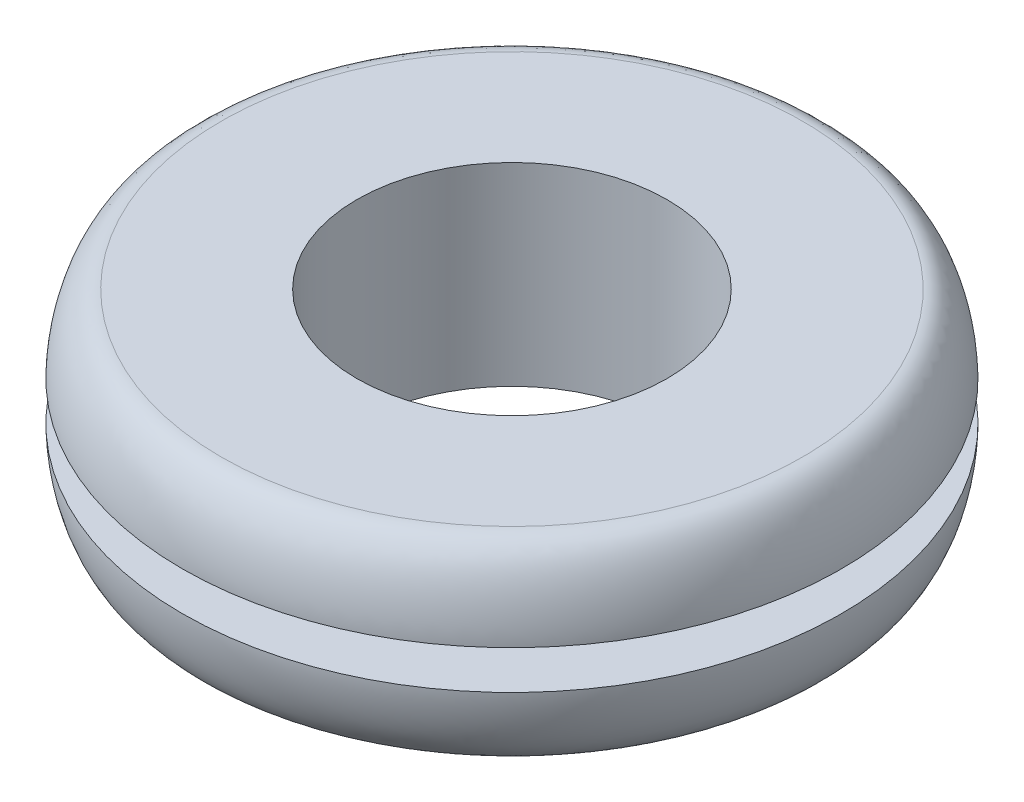
ISO-10303-21;
HEADER;
FILE_DESCRIPTION(('STEP AP214'),'2;1');
FILE_NAME('part.step','',(''),(''),'','','');
FILE_SCHEMA(('AUTOMOTIVE_DESIGN { 1 0 10303 214 1 1 1 1 }'));
ENDSEC;
DATA;
#1=APPLICATION_CONTEXT('core data for automotive mechanical design processes');
#2=APPLICATION_PROTOCOL_DEFINITION('international standard','automotive_design',2000,#1);
#3=PRODUCT_CONTEXT('',#1,'mechanical');
#4=PRODUCT('Part','Part','',(#3));
#5=PRODUCT_RELATED_PRODUCT_CATEGORY('part','',(#4));
#6=PRODUCT_DEFINITION_FORMATION('','',#4);
#7=PRODUCT_DEFINITION_CONTEXT('part definition',#1,'design');
#8=PRODUCT_DEFINITION('design','',#6,#7);
#9=PRODUCT_DEFINITION_SHAPE('','',#8);
#10=(LENGTH_UNIT() NAMED_UNIT(*) SI_UNIT(.MILLI.,.METRE.));
#11=(NAMED_UNIT(*) PLANE_ANGLE_UNIT() SI_UNIT($,.RADIAN.));
#12=(NAMED_UNIT(*) SI_UNIT($,.STERADIAN.) SOLID_ANGLE_UNIT());
#13=UNCERTAINTY_MEASURE_WITH_UNIT(LENGTH_MEASURE(1.E-05),#10,'distance_accuracy_value','');
#14=(GEOMETRIC_REPRESENTATION_CONTEXT(3) GLOBAL_UNCERTAINTY_ASSIGNED_CONTEXT((#13)) GLOBAL_UNIT_ASSIGNED_CONTEXT((#10,
#11,#12)) REPRESENTATION_CONTEXT('',''));
#15=CARTESIAN_POINT('',(0.,0.,0.));
#16=DIRECTION('',(0.,0.,1.));
#17=DIRECTION('',(1.,0.,0.));
#18=AXIS2_PLACEMENT_3D('',#15,#16,#17);
#19=CARTESIAN_POINT('',(-6.35,3.96875,0.));
#20=DIRECTION('',(0.,1.,0.));
#21=DIRECTION('',(0.,0.,1.));
#22=AXIS2_PLACEMENT_3D('',#19,#20,#21);
#23=PLANE('',#22);
#24=CARTESIAN_POINT('',(0.,3.96875000000001,0.));
#25=DIRECTION('',(0.,1.,0.));
#26=DIRECTION('',(0.,0.,1.));
#27=AXIS2_PLACEMENT_3D('',#24,#25,#26);
#28=CIRCLE('',#27,11.90625);
#29=CARTESIAN_POINT('',(0.,3.96875000000001,11.90625));
#30=VERTEX_POINT('',#29);
#31=EDGE_CURVE('E63',#30,#30,#28,.T.);
#32=ORIENTED_EDGE('',*,*,#31,.T.);
#33=EDGE_LOOP('',(#32));
#34=FACE_BOUND('',#33,.T.);
#35=CARTESIAN_POINT('',(0.,3.96874999999999,0.));
#36=DIRECTION('',(0.,1.,0.));
#37=DIRECTION('',(0.,0.,1.));
#38=AXIS2_PLACEMENT_3D('',#35,#36,#37);
#39=CIRCLE('',#38,6.35);
#40=CARTESIAN_POINT('',(0.,3.96874999999999,6.35));
#41=VERTEX_POINT('',#40);
#42=EDGE_CURVE('E10',#41,#41,#39,.T.);
#43=ORIENTED_EDGE('',*,*,#42,.F.);
#44=EDGE_LOOP('',(#43));
#45=FACE_BOUND('',#44,.T.);
#46=ADVANCED_FACE('F35',(#34,#45),#23,.T.);
#47=CARTESIAN_POINT('',(0.,96.2646314073627,0.));
#48=DIRECTION('',(0.,1.,0.));
#49=DIRECTION('',(0.,0.,1.));
#50=AXIS2_PLACEMENT_3D('',#47,#48,#49);
#51=CYLINDRICAL_SURFACE('',#50,6.35);
#52=ORIENTED_EDGE('',*,*,#42,.T.);
#53=EDGE_LOOP('',(#52));
#54=FACE_BOUND('',#53,.T.);
#55=CARTESIAN_POINT('',(0.,-3.96875000000001,0.));
#56=DIRECTION('',(0.,1.,0.));
#57=DIRECTION('',(0.,0.,1.));
#58=AXIS2_PLACEMENT_3D('',#55,#56,#57);
#59=CIRCLE('',#58,6.35);
#60=CARTESIAN_POINT('',(0.,-3.96875000000001,6.35));
#61=VERTEX_POINT('',#60);
#62=EDGE_CURVE('E41',#61,#61,#59,.T.);
#63=ORIENTED_EDGE('',*,*,#62,.F.);
#64=EDGE_LOOP('',(#63));
#65=FACE_BOUND('',#64,.T.);
#66=ADVANCED_FACE('F86',(#54,#65),#51,.F.);
#67=CARTESIAN_POINT('',(-6.35,-3.96875,0.));
#68=DIRECTION('',(0.,-1.,0.));
#69=DIRECTION('',(0.,0.,-1.));
#70=AXIS2_PLACEMENT_3D('',#67,#68,#69);
#71=PLANE('',#70);
#72=ORIENTED_EDGE('',*,*,#62,.T.);
#73=EDGE_LOOP('',(#72));
#74=FACE_BOUND('',#73,.T.);
#75=CARTESIAN_POINT('',(0.,-3.96875000000001,0.));
#76=DIRECTION('',(0.,1.,0.));
#77=DIRECTION('',(0.,0.,1.));
#78=AXIS2_PLACEMENT_3D('',#75,#76,#77);
#79=CIRCLE('',#78,11.90625);
#80=CARTESIAN_POINT('',(0.,-3.96875000000001,11.90625));
#81=VERTEX_POINT('',#80);
#82=EDGE_CURVE('E45',#81,#81,#79,.T.);
#83=ORIENTED_EDGE('',*,*,#82,.F.);
#84=EDGE_LOOP('',(#83));
#85=FACE_BOUND('',#84,.T.);
#86=ADVANCED_FACE('F82',(#74,#85),#71,.T.);
#87=CARTESIAN_POINT('',(-13.49375,-0.793749999999997,0.));
#88=CARTESIAN_POINT('',(-13.49375,-1.83283233076052,0.));
#89=CARTESIAN_POINT('',(-13.0520157459829,-3.96875,0.));
#90=CARTESIAN_POINT('',(-11.90625,-3.96875,0.));
#91=B_SPLINE_CURVE_WITH_KNOTS('',3,(#87,#88,#89,#90),.UNSPECIFIED.,.F.,.F.,(4,4),(0.,1.),.UNSPECIFIED.);
#92=CARTESIAN_POINT('',(0.,96.2646314073627,0.));
#93=DIRECTION('',(0.,1.,0.));
#94=AXIS1_PLACEMENT('',#92,#93);
#95=SURFACE_OF_REVOLUTION('',#91,#94);
#96=ORIENTED_EDGE('',*,*,#82,.T.);
#97=EDGE_LOOP('',(#96));
#98=FACE_BOUND('',#97,.T.);
#99=CARTESIAN_POINT('',(0.,-0.793749999999996,0.));
#100=DIRECTION('',(0.,1.,0.));
#101=DIRECTION('',(0.,0.,1.));
#102=AXIS2_PLACEMENT_3D('',#99,#100,#101);
#103=CIRCLE('',#102,13.49375);
#104=CARTESIAN_POINT('',(0.,-0.793749999999996,13.49375));
#105=VERTEX_POINT('',#104);
#106=EDGE_CURVE('E49',#105,#105,#103,.T.);
#107=ORIENTED_EDGE('',*,*,#106,.F.);
#108=EDGE_LOOP('',(#107));
#109=FACE_BOUND('',#108,.T.);
#110=ADVANCED_FACE('F77',(#98,#109),#95,.F.);
#111=CARTESIAN_POINT('',(-13.49375,-0.793749999999998,0.));
#112=DIRECTION('',(0.,1.,0.));
#113=DIRECTION('',(0.,0.,1.));
#114=AXIS2_PLACEMENT_3D('',#111,#112,#113);
#115=PLANE('',#114);
#116=ORIENTED_EDGE('',*,*,#106,.T.);
#117=EDGE_LOOP('',(#116));
#118=FACE_BOUND('',#117,.T.);
#119=CARTESIAN_POINT('',(0.,-0.793749999999996,0.));
#120=DIRECTION('',(0.,1.,0.));
#121=DIRECTION('',(0.,0.,1.));
#122=AXIS2_PLACEMENT_3D('',#119,#120,#121);
#123=CIRCLE('',#122,10.31875);
#124=CARTESIAN_POINT('',(0.,-0.793749999999996,10.31875));
#125=VERTEX_POINT('',#124);
#126=EDGE_CURVE('E54',#125,#125,#123,.T.);
#127=ORIENTED_EDGE('',*,*,#126,.F.);
#128=EDGE_LOOP('',(#127));
#129=FACE_BOUND('',#128,.T.);
#130=ADVANCED_FACE('F81',(#118,#129),#115,.T.);
#131=CARTESIAN_POINT('',(0.,96.2646314073627,0.));
#132=DIRECTION('',(0.,1.,0.));
#133=DIRECTION('',(0.,0.,1.));
#134=AXIS2_PLACEMENT_3D('',#131,#132,#133);
#135=CYLINDRICAL_SURFACE('',#134,10.31875);
#136=ORIENTED_EDGE('',*,*,#126,.T.);
#137=EDGE_LOOP('',(#136));
#138=FACE_BOUND('',#137,.T.);
#139=CARTESIAN_POINT('',(0.,0.793749999999996,0.));
#140=DIRECTION('',(0.,1.,0.));
#141=DIRECTION('',(0.,0.,1.));
#142=AXIS2_PLACEMENT_3D('',#139,#140,#141);
#143=CIRCLE('',#142,10.31875);
#144=CARTESIAN_POINT('',(0.,0.793749999999996,10.31875));
#145=VERTEX_POINT('',#144);
#146=EDGE_CURVE('E57',#145,#145,#143,.T.);
#147=ORIENTED_EDGE('',*,*,#146,.F.);
#148=EDGE_LOOP('',(#147));
#149=FACE_BOUND('',#148,.T.);
#150=ADVANCED_FACE('F106',(#138,#149),#135,.T.);
#151=CARTESIAN_POINT('',(-13.49375,0.79375,0.));
#152=DIRECTION('',(0.,-1.,0.));
#153=DIRECTION('',(0.,0.,-1.));
#154=AXIS2_PLACEMENT_3D('',#151,#152,#153);
#155=PLANE('',#154);
#156=ORIENTED_EDGE('',*,*,#146,.T.);
#157=EDGE_LOOP('',(#156));
#158=FACE_BOUND('',#157,.T.);
#159=CARTESIAN_POINT('',(0.,0.793749999999996,0.));
#160=DIRECTION('',(0.,1.,0.));
#161=DIRECTION('',(0.,0.,1.));
#162=AXIS2_PLACEMENT_3D('',#159,#160,#161);
#163=CIRCLE('',#162,13.49375);
#164=CARTESIAN_POINT('',(0.,0.793749999999996,13.49375));
#165=VERTEX_POINT('',#164);
#166=EDGE_CURVE('E60',#165,#165,#163,.T.);
#167=ORIENTED_EDGE('',*,*,#166,.F.);
#168=EDGE_LOOP('',(#167));
#169=FACE_BOUND('',#168,.T.);
#170=ADVANCED_FACE('F100',(#158,#169),#155,.T.);
#171=CARTESIAN_POINT('',(-11.90625,3.96875,0.));
#172=CARTESIAN_POINT('',(-13.0520157459829,3.96875,0.));
#173=CARTESIAN_POINT('',(-13.49375,1.83283233076052,0.));
#174=CARTESIAN_POINT('',(-13.49375,0.793749999999997,0.));
#175=B_SPLINE_CURVE_WITH_KNOTS('',3,(#171,#172,#173,#174),.UNSPECIFIED.,.F.,.F.,(4,4),(0.,1.),.UNSPECIFIED.);
#176=CARTESIAN_POINT('',(0.,96.2646314073627,0.));
#177=DIRECTION('',(0.,1.,0.));
#178=AXIS1_PLACEMENT('',#176,#177);
#179=SURFACE_OF_REVOLUTION('',#175,#178);
#180=ORIENTED_EDGE('',*,*,#166,.T.);
#181=EDGE_LOOP('',(#180));
#182=FACE_BOUND('',#181,.T.);
#183=ORIENTED_EDGE('',*,*,#31,.F.);
#184=EDGE_LOOP('',(#183));
#185=FACE_BOUND('',#184,.T.);
#186=ADVANCED_FACE('F98',(#182,#185),#179,.F.);
#187=CLOSED_SHELL('',(#46,#66,#86,#110,#130,#150,#170,#186));
#188=MANIFOLD_SOLID_BREP('B2',#187);
#189=ADVANCED_BREP_SHAPE_REPRESENTATION('',(#18,#188),#14);
#190=SHAPE_DEFINITION_REPRESENTATION(#9,#189);
ENDSEC;
END-ISO-10303-21;
